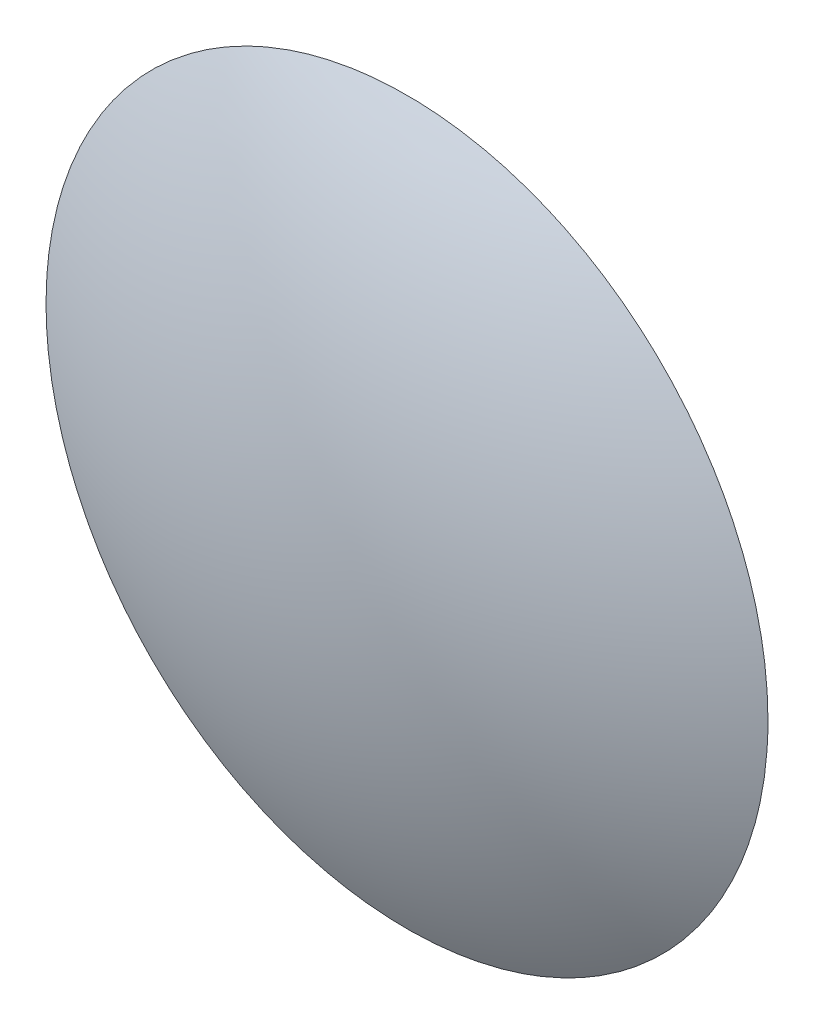
ISO-10303-21;
HEADER;
FILE_DESCRIPTION(('STEP AP214'),'2;1');
FILE_NAME('part.step','',(''),(''),'','','');
FILE_SCHEMA(('AUTOMOTIVE_DESIGN { 1 0 10303 214 1 1 1 1 }'));
ENDSEC;
DATA;
#1=APPLICATION_CONTEXT('core data for automotive mechanical design processes');
#2=APPLICATION_PROTOCOL_DEFINITION('international standard','automotive_design',2000,#1);
#3=PRODUCT_CONTEXT('',#1,'mechanical');
#4=PRODUCT('Part','Part','',(#3));
#5=PRODUCT_RELATED_PRODUCT_CATEGORY('part','',(#4));
#6=PRODUCT_DEFINITION_FORMATION('','',#4);
#7=PRODUCT_DEFINITION_CONTEXT('part definition',#1,'design');
#8=PRODUCT_DEFINITION('design','',#6,#7);
#9=PRODUCT_DEFINITION_SHAPE('','',#8);
#10=(LENGTH_UNIT() NAMED_UNIT(*) SI_UNIT(.MILLI.,.METRE.));
#11=(NAMED_UNIT(*) PLANE_ANGLE_UNIT() SI_UNIT($,.RADIAN.));
#12=(NAMED_UNIT(*) SI_UNIT($,.STERADIAN.) SOLID_ANGLE_UNIT());
#13=UNCERTAINTY_MEASURE_WITH_UNIT(LENGTH_MEASURE(1.E-05),#10,'distance_accuracy_value','');
#14=(GEOMETRIC_REPRESENTATION_CONTEXT(3) GLOBAL_UNCERTAINTY_ASSIGNED_CONTEXT((#13)) GLOBAL_UNIT_ASSIGNED_CONTEXT((#10,
#11,#12)) REPRESENTATION_CONTEXT('',''));
#15=CARTESIAN_POINT('',(0.,0.,0.));
#16=DIRECTION('',(0.,0.,1.));
#17=DIRECTION('',(1.,0.,0.));
#18=AXIS2_PLACEMENT_3D('',#15,#16,#17);
#19=CARTESIAN_POINT('',(3.5,2.,12.8));
#20=DIRECTION('',(0.,0.,-1.));
#21=DIRECTION('',(-1.,0.,0.));
#22=AXIS2_PLACEMENT_3D('',#19,#20,#21);
#23=PLANE('',#22);
#24=CARTESIAN_POINT('',(5.49999999999997,2.,12.8));
#25=CARTESIAN_POINT('',(5.49999501830888,2.11234088393289,12.8000000000001));
#26=CARTESIAN_POINT('',(5.4905028838728,2.22476322559349,12.8000000000003));
#27=CARTESIAN_POINT('',(5.45276859922376,2.44651172679386,12.7999999999997));
#28=CARTESIAN_POINT('',(5.42450388247335,2.55583399461214,12.799999999999));
#29=CARTESIAN_POINT('',(5.3500290641869,2.76813769804899,12.7999999999991));
#30=CARTESIAN_POINT('',(5.3038275332062,2.87112213481955,12.8));
#31=CARTESIAN_POINT('',(5.19480235085552,3.06784380972379,12.8000000000001));
#32=CARTESIAN_POINT('',(5.13198283268133,3.16158333928638,12.7999999999993));
#33=CARTESIAN_POINT('',(4.99149220719555,3.3371970983038,12.7999999999991));
#34=CARTESIAN_POINT('',(4.91381954648972,3.41907008513777,12.7999999999998));
#35=CARTESIAN_POINT('',(4.74582829627506,3.56861687177598,12.8000000000002));
#36=CARTESIAN_POINT('',(4.65550921039538,3.63629011398112,12.8000000000001));
#37=CARTESIAN_POINT('',(4.46479322861768,3.7555114083845,12.7999999999999));
#38=CARTESIAN_POINT('',(4.3643965204431,3.80705976087955,12.8));
#39=CARTESIAN_POINT('',(4.15637406016523,3.89256952340773,12.8));
#40=CARTESIAN_POINT('',(4.04874832259856,3.9265309688046,12.8));
#41=CARTESIAN_POINT('',(3.82932258861286,3.97590307610689,12.8));
#42=CARTESIAN_POINT('',(3.71752258423659,3.99131370264775,12.8));
#43=CARTESIAN_POINT('',(3.49292239249132,4.00314657525839,12.8));
#44=CARTESIAN_POINT('',(3.38012220692492,3.99956885554327,12.8));
#45=CARTESIAN_POINT('',(3.15672347111542,3.97352667238582,12.8));
#46=CARTESIAN_POINT('',(3.04612492169387,3.95106220189598,12.8));
#47=CARTESIAN_POINT('',(2.83026895181438,3.88788417341462,12.8));
#48=CARTESIAN_POINT('',(2.72501153699472,3.84717059615922,12.8));
#49=CARTESIAN_POINT('',(2.52282594670551,3.74865010522097,12.8));
#50=CARTESIAN_POINT('',(2.42589776852546,3.69084319710064,12.8));
#51=CARTESIAN_POINT('',(2.24312215715356,3.55977703496567,12.8));
#52=CARTESIAN_POINT('',(2.15727471947661,3.48651778720561,12.8));
#53=CARTESIAN_POINT('',(1.99909748750776,3.32662653450797,12.8));
#54=CARTESIAN_POINT('',(1.92676769506834,3.23999452773776,12.8));
#55=CARTESIAN_POINT('',(1.79767898963162,3.05581697990551,12.8));
#56=CARTESIAN_POINT('',(1.74092007866918,2.95827143741727,12.8));
#57=CARTESIAN_POINT('',(1.64458436960039,2.75503586325046,12.8));
#58=CARTESIAN_POINT('',(1.60500757075837,2.64934583192063,12.8));
#59=CARTESIAN_POINT('',(1.54415955275495,2.43282151067004,12.8));
#60=CARTESIAN_POINT('',(1.52288833276888,2.32198722098104,12.7999999999999));
#61=CARTESIAN_POINT('',(1.499255296819,2.0983206380606,12.8000000000001));
#62=CARTESIAN_POINT('',(1.49689348085519,1.98548834482916,12.8000000000003));
#63=CARTESIAN_POINT('',(1.51114629828088,1.76102872667176,12.7999999999997));
#64=CARTESIAN_POINT('',(1.52776093252529,1.64940140180008,12.799999999999));
#65=CARTESIAN_POINT('',(1.57949501224928,1.43052049252818,12.7999999999991));
#66=CARTESIAN_POINT('',(1.61461445852117,1.32326690831524,12.8));
#67=CARTESIAN_POINT('',(1.70236121906253,1.11617811332277,12.8));
#68=CARTESIAN_POINT('',(1.75498853104402,1.01634290157379,12.7999999999992));
#69=CARTESIAN_POINT('',(1.87625708132779,0.826924876785721,12.799999999999));
#70=CARTESIAN_POINT('',(1.94489831743552,0.737342062341639,12.7999999999997));
#71=CARTESIAN_POINT('',(2.09624622856964,0.570971774234892,12.8000000000002));
#72=CARTESIAN_POINT('',(2.17895290928924,0.494184305751368,12.8000000000001));
#73=CARTESIAN_POINT('',(2.35608391893797,0.355584502446333,12.7999999999999));
#74=CARTESIAN_POINT('',(2.45050825168025,0.293772172498032,12.8));
#75=CARTESIAN_POINT('',(2.64839400719136,0.186877407512967,12.8));
#76=CARTESIAN_POINT('',(2.75185542042047,0.141794954816055,12.8));
#77=CARTESIAN_POINT('',(2.96487842021177,0.0696396222010336,12.8));
#78=CARTESIAN_POINT('',(3.0744400044977,0.0425667355627232,12.8));
#79=CARTESIAN_POINT('',(3.29655345750725,0.00719899604766763,12.8));
#80=CARTESIAN_POINT('',(3.40910533161872,-0.00109582299279311,12.8));
#81=CARTESIAN_POINT('',(3.63400393579934,0.00132813085581984,12.8));
#82=CARTESIAN_POINT('',(3.74635066625914,0.0120468674982905,12.8));
#83=CARTESIAN_POINT('',(3.96765023563066,0.0521936489838902,12.8));
#84=CARTESIAN_POINT('',(4.07660306771743,0.0816217314478704,12.8));
#85=CARTESIAN_POINT('',(4.288023717224,0.158352505631492,12.8));
#86=CARTESIAN_POINT('',(4.39049141382492,0.205655530249102,12.8));
#87=CARTESIAN_POINT('',(4.58602688785108,0.316791392776257,12.8));
#88=CARTESIAN_POINT('',(4.67909503415319,0.380623581662991,12.8));
#89=CARTESIAN_POINT('',(4.85318491206682,0.522998167224033,12.8));
#90=CARTESIAN_POINT('',(4.93420790307398,0.601539024072786,12.8));
#91=CARTESIAN_POINT('',(5.08193852304526,0.771131393260282,12.8));
#92=CARTESIAN_POINT('',(5.14864258897119,0.862186010226635,12.8));
#93=CARTESIAN_POINT('',(5.26584229417062,1.05423701947461,12.8));
#94=CARTESIAN_POINT('',(5.31633017935904,1.15523813780074,12.8));
#95=CARTESIAN_POINT('',(5.39957454112377,1.36420380545217,12.8));
#96=CARTESIAN_POINT('',(5.43235227258269,1.47215983280151,12.8));
#97=CARTESIAN_POINT('',(5.47050988941554,1.65066989020879,12.8));
#98=CARTESIAN_POINT('',(5.48155487929507,1.72006400179342,12.8));
#99=CARTESIAN_POINT('',(5.49630149111703,1.85962813916583,12.8));
#100=CARTESIAN_POINT('',(5.50000311305947,1.92979816495362,12.8));
#101=CARTESIAN_POINT('',(5.49999999999997,2.,12.8));
#102=B_SPLINE_CURVE_WITH_KNOTS('',3,(#24,#25,#26,#27,#28,#29,#30,#31,#32,#33,#34,#35,#36,#37,
#38,#39,#40,#41,#42,#43,#44,#45,#46,#47,#48,#49,#50,#51,#52,#53,#54,#55,#56,#57,#58,#59,#60,#61,
#62,#63,#64,#65,#66,#67,#68,#69,#70,#71,#72,#73,#74,#75,#76,#77,#78,#79,#80,#81,#82,#83,#84,#85,
#86,#87,#88,#89,#90,#91,#92,#93,#94,#95,#96,#97,#98,#99,#100,#101),.UNSPECIFIED.,.T.,.F.,(4,2,2,
2,2,2,2,2,2,2,2,2,2,2,2,2,2,2,2,2,2,2,2,2,2,2,2,2,2,2,2,2,2,2,2,2,2,2,4),(0.,0.33676641524773,
0.67393839217969,1.01094945973899,1.34787678519445,1.68483936699329,2.0218151782471,
2.35878471356387,2.69575357129966,3.03272307141854,3.36969196435222,3.7066609830247,
4.04363035740478,4.38059962212794,4.71756875045735,5.05453792496555,5.39150714350991,
5.72847634762652,6.06544553656247,6.40241472549813,6.73938392961447,7.07635314815888,
7.41332232266711,7.750291450997,8.08726071572074,8.42423009010087,8.7611991087733,
9.09816800170694,9.43513750182586,9.77210635956169,10.1090758948784,10.4460517061317,
10.78301428793,11.1199416133858,11.4569526809454,11.7941246578778,12.1308910731258,
12.3413364560062,12.5517818388866),.UNSPECIFIED.);
#103=CARTESIAN_POINT('',(5.49999999999997,2.,12.8));
#104=VERTEX_POINT('',#103);
#105=EDGE_CURVE('E10',#104,#104,#102,.T.);
#106=ORIENTED_EDGE('',*,*,#105,.F.);
#107=EDGE_LOOP('',(#106));
#108=FACE_BOUND('',#107,.T.);
#109=ADVANCED_FACE('F15',(#108),#23,.T.);
#110=CARTESIAN_POINT('',(3.5,2.,9.05));
#111=DIRECTION('',(1.,0.,0.));
#112=DIRECTION('',(0.,-1.,0.));
#113=AXIS2_PLACEMENT_3D('',#110,#111,#112);
#114=SPHERICAL_SURFACE('',#113,4.25);
#115=ORIENTED_EDGE('',*,*,#105,.T.);
#116=EDGE_LOOP('',(#115));
#117=FACE_BOUND('',#116,.T.);
#118=ADVANCED_FACE('F26',(#117),#114,.T.);
#119=CLOSED_SHELL('',(#109,#118));
#120=MANIFOLD_SOLID_BREP('B1',#119);
#121=ADVANCED_BREP_SHAPE_REPRESENTATION('',(#18,#120),#14);
#122=SHAPE_DEFINITION_REPRESENTATION(#9,#121);
ENDSEC;
END-ISO-10303-21;
